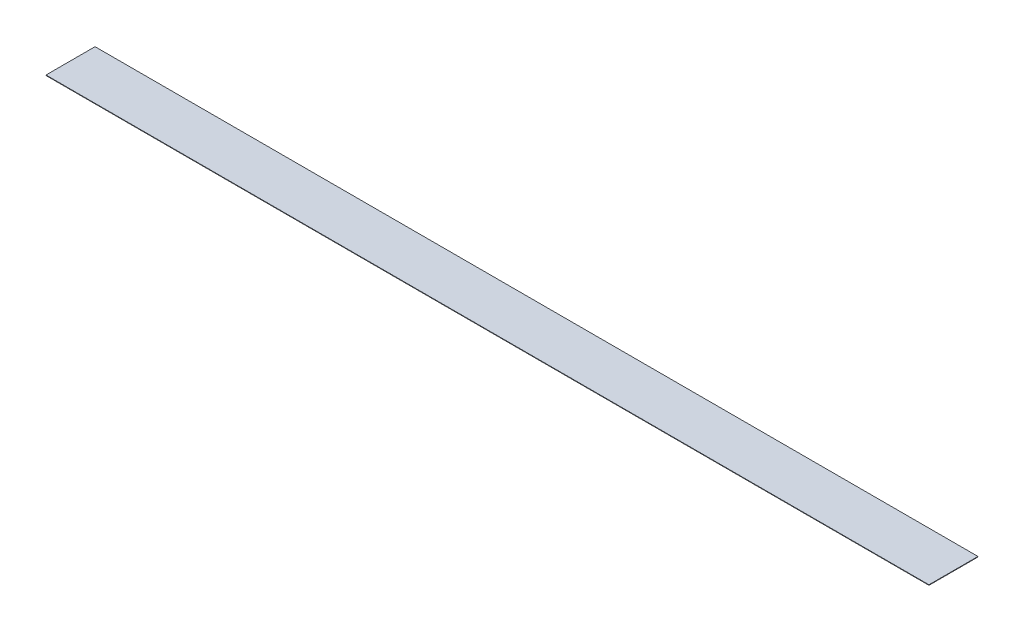
ISO-10303-21;
HEADER;
FILE_DESCRIPTION(('STEP AP214'),'2;1');
FILE_NAME('part.step','',(''),(''),'','','');
FILE_SCHEMA(('AUTOMOTIVE_DESIGN { 1 0 10303 214 1 1 1 1 }'));
ENDSEC;
DATA;
#1=APPLICATION_CONTEXT('core data for automotive mechanical design processes');
#2=APPLICATION_PROTOCOL_DEFINITION('international standard','automotive_design',2000,#1);
#3=PRODUCT_CONTEXT('',#1,'mechanical');
#4=PRODUCT('Part','Part','',(#3));
#5=PRODUCT_RELATED_PRODUCT_CATEGORY('part','',(#4));
#6=PRODUCT_DEFINITION_FORMATION('','',#4);
#7=PRODUCT_DEFINITION_CONTEXT('part definition',#1,'design');
#8=PRODUCT_DEFINITION('design','',#6,#7);
#9=PRODUCT_DEFINITION_SHAPE('','',#8);
#10=(LENGTH_UNIT() NAMED_UNIT(*) SI_UNIT(.MILLI.,.METRE.));
#11=(NAMED_UNIT(*) PLANE_ANGLE_UNIT() SI_UNIT($,.RADIAN.));
#12=(NAMED_UNIT(*) SI_UNIT($,.STERADIAN.) SOLID_ANGLE_UNIT());
#13=UNCERTAINTY_MEASURE_WITH_UNIT(LENGTH_MEASURE(1.E-05),#10,'distance_accuracy_value','');
#14=(GEOMETRIC_REPRESENTATION_CONTEXT(3) GLOBAL_UNCERTAINTY_ASSIGNED_CONTEXT((#13)) GLOBAL_UNIT_ASSIGNED_CONTEXT((#10,
#11,#12)) REPRESENTATION_CONTEXT('',''));
#15=CARTESIAN_POINT('',(0.,0.,0.));
#16=DIRECTION('',(0.,0.,1.));
#17=DIRECTION('',(1.,0.,0.));
#18=AXIS2_PLACEMENT_3D('',#15,#16,#17);
#19=CARTESIAN_POINT('',(114.3,0.125,-6.35));
#20=DIRECTION('',(-1.,0.,0.));
#21=DIRECTION('',(0.,0.,1.));
#22=AXIS2_PLACEMENT_3D('',#19,#20,#21);
#23=PLANE('',#22);
#24=DIRECTION('',(0.,0.,-1.));
#25=VECTOR('',#24,1.);
#26=CARTESIAN_POINT('',(114.3,0.,-6.35));
#27=LINE('',#26,#25);
#28=CARTESIAN_POINT('',(114.3,0.,6.35));
#29=VERTEX_POINT('',#28);
#30=CARTESIAN_POINT('',(114.3,0.,-6.35));
#31=VERTEX_POINT('',#30);
#32=EDGE_CURVE('E115',#29,#31,#27,.T.);
#33=ORIENTED_EDGE('',*,*,#32,.T.);
#34=DIRECTION('',(0.,-1.,0.));
#35=VECTOR('',#34,1.);
#36=CARTESIAN_POINT('',(114.3,0.125,-6.35));
#37=LINE('',#36,#35);
#38=CARTESIAN_POINT('',(114.3,0.125,-6.35));
#39=VERTEX_POINT('',#38);
#40=EDGE_CURVE('E11',#39,#31,#37,.T.);
#41=ORIENTED_EDGE('',*,*,#40,.F.);
#42=DIRECTION('',(0.,0.,-1.));
#43=VECTOR('',#42,1.);
#44=CARTESIAN_POINT('',(114.3,0.125,-6.35));
#45=LINE('',#44,#43);
#46=CARTESIAN_POINT('',(114.3,0.125,6.35));
#47=VERTEX_POINT('',#46);
#48=EDGE_CURVE('E99',#47,#39,#45,.T.);
#49=ORIENTED_EDGE('',*,*,#48,.F.);
#50=DIRECTION('',(0.,-1.,0.));
#51=VECTOR('',#50,1.);
#52=CARTESIAN_POINT('',(114.3,0.125,6.35));
#53=LINE('',#52,#51);
#54=EDGE_CURVE('E111',#47,#29,#53,.T.);
#55=ORIENTED_EDGE('',*,*,#54,.T.);
#56=EDGE_LOOP('',(#33,#41,#49,#55));
#57=FACE_BOUND('',#56,.T.);
#58=ADVANCED_FACE('F47',(#57),#23,.F.);
#59=CARTESIAN_POINT('',(-114.3,0.125,-6.35));
#60=DIRECTION('',(0.,0.,1.));
#61=DIRECTION('',(1.,0.,0.));
#62=AXIS2_PLACEMENT_3D('',#59,#60,#61);
#63=PLANE('',#62);
#64=DIRECTION('',(-1.,0.,0.));
#65=VECTOR('',#64,1.);
#66=CARTESIAN_POINT('',(-114.3,0.,-6.35));
#67=LINE('',#66,#65);
#68=CARTESIAN_POINT('',(-114.3,0.,-6.35));
#69=VERTEX_POINT('',#68);
#70=EDGE_CURVE('E104',#31,#69,#67,.T.);
#71=ORIENTED_EDGE('',*,*,#70,.T.);
#72=DIRECTION('',(0.,-1.,0.));
#73=VECTOR('',#72,1.);
#74=CARTESIAN_POINT('',(-114.3,0.125,-6.35));
#75=LINE('',#74,#73);
#76=CARTESIAN_POINT('',(-114.3,0.125,-6.35));
#77=VERTEX_POINT('',#76);
#78=EDGE_CURVE('E56',#77,#69,#75,.T.);
#79=ORIENTED_EDGE('',*,*,#78,.F.);
#80=DIRECTION('',(-1.,0.,0.));
#81=VECTOR('',#80,1.);
#82=CARTESIAN_POINT('',(-114.3,0.125,-6.35));
#83=LINE('',#82,#81);
#84=EDGE_CURVE('E94',#39,#77,#83,.T.);
#85=ORIENTED_EDGE('',*,*,#84,.F.);
#86=ORIENTED_EDGE('',*,*,#40,.T.);
#87=EDGE_LOOP('',(#71,#79,#85,#86));
#88=FACE_BOUND('',#87,.T.);
#89=ADVANCED_FACE('F103',(#88),#63,.F.);
#90=CARTESIAN_POINT('',(-114.3,0.125,-6.35));
#91=DIRECTION('',(1.,0.,0.));
#92=DIRECTION('',(0.,0.,-1.));
#93=AXIS2_PLACEMENT_3D('',#90,#91,#92);
#94=PLANE('',#93);
#95=DIRECTION('',(0.,0.,1.));
#96=VECTOR('',#95,1.);
#97=CARTESIAN_POINT('',(-114.3,0.,-6.35));
#98=LINE('',#97,#96);
#99=CARTESIAN_POINT('',(-114.3,0.,6.35));
#100=VERTEX_POINT('',#99);
#101=EDGE_CURVE('E81',#69,#100,#98,.T.);
#102=ORIENTED_EDGE('',*,*,#101,.T.);
#103=DIRECTION('',(0.,-1.,0.));
#104=VECTOR('',#103,1.);
#105=CARTESIAN_POINT('',(-114.3,0.125,6.35));
#106=LINE('',#105,#104);
#107=CARTESIAN_POINT('',(-114.3,0.125,6.35));
#108=VERTEX_POINT('',#107);
#109=EDGE_CURVE('E106',#108,#100,#106,.T.);
#110=ORIENTED_EDGE('',*,*,#109,.F.);
#111=DIRECTION('',(0.,0.,1.));
#112=VECTOR('',#111,1.);
#113=CARTESIAN_POINT('',(-114.3,0.125,-6.35));
#114=LINE('',#113,#112);
#115=EDGE_CURVE('E97',#77,#108,#114,.T.);
#116=ORIENTED_EDGE('',*,*,#115,.F.);
#117=ORIENTED_EDGE('',*,*,#78,.T.);
#118=EDGE_LOOP('',(#102,#110,#116,#117));
#119=FACE_BOUND('',#118,.T.);
#120=ADVANCED_FACE('F107',(#119),#94,.F.);
#121=CARTESIAN_POINT('',(-114.3,0.125,6.35));
#122=DIRECTION('',(0.,0.,-1.));
#123=DIRECTION('',(-1.,0.,0.));
#124=AXIS2_PLACEMENT_3D('',#121,#122,#123);
#125=PLANE('',#124);
#126=DIRECTION('',(1.,0.,0.));
#127=VECTOR('',#126,1.);
#128=CARTESIAN_POINT('',(-114.3,0.,6.35));
#129=LINE('',#128,#127);
#130=EDGE_CURVE('E87',#100,#29,#129,.T.);
#131=ORIENTED_EDGE('',*,*,#130,.T.);
#132=ORIENTED_EDGE('',*,*,#54,.F.);
#133=DIRECTION('',(1.,0.,0.));
#134=VECTOR('',#133,1.);
#135=CARTESIAN_POINT('',(-114.3,0.125,6.35));
#136=LINE('',#135,#134);
#137=EDGE_CURVE('E64',#108,#47,#136,.T.);
#138=ORIENTED_EDGE('',*,*,#137,.F.);
#139=ORIENTED_EDGE('',*,*,#109,.T.);
#140=EDGE_LOOP('',(#131,#132,#138,#139));
#141=FACE_BOUND('',#140,.T.);
#142=ADVANCED_FACE('F128',(#141),#125,.F.);
#143=CARTESIAN_POINT('',(0.,0.125,0.));
#144=DIRECTION('',(0.,1.,0.));
#145=DIRECTION('',(0.,0.,1.));
#146=AXIS2_PLACEMENT_3D('',#143,#144,#145);
#147=PLANE('',#146);
#148=ORIENTED_EDGE('',*,*,#48,.T.);
#149=ORIENTED_EDGE('',*,*,#84,.T.);
#150=ORIENTED_EDGE('',*,*,#115,.T.);
#151=ORIENTED_EDGE('',*,*,#137,.T.);
#152=EDGE_LOOP('',(#148,#149,#150,#151));
#153=FACE_BOUND('',#152,.T.);
#154=ADVANCED_FACE('F95',(#153),#147,.T.);
#155=CARTESIAN_POINT('',(0.,0.,0.));
#156=DIRECTION('',(0.,1.,0.));
#157=DIRECTION('',(0.,0.,1.));
#158=AXIS2_PLACEMENT_3D('',#155,#156,#157);
#159=PLANE('',#158);
#160=ORIENTED_EDGE('',*,*,#32,.F.);
#161=ORIENTED_EDGE('',*,*,#130,.F.);
#162=ORIENTED_EDGE('',*,*,#101,.F.);
#163=ORIENTED_EDGE('',*,*,#70,.F.);
#164=EDGE_LOOP('',(#160,#161,#162,#163));
#165=FACE_BOUND('',#164,.T.);
#166=ADVANCED_FACE('F131',(#165),#159,.F.);
#167=CLOSED_SHELL('',(#58,#89,#120,#142,#154,#166));
#168=MANIFOLD_SOLID_BREP('B2',#167);
#169=ADVANCED_BREP_SHAPE_REPRESENTATION('',(#18,#168),#14);
#170=SHAPE_DEFINITION_REPRESENTATION(#9,#169);
ENDSEC;
END-ISO-10303-21;
